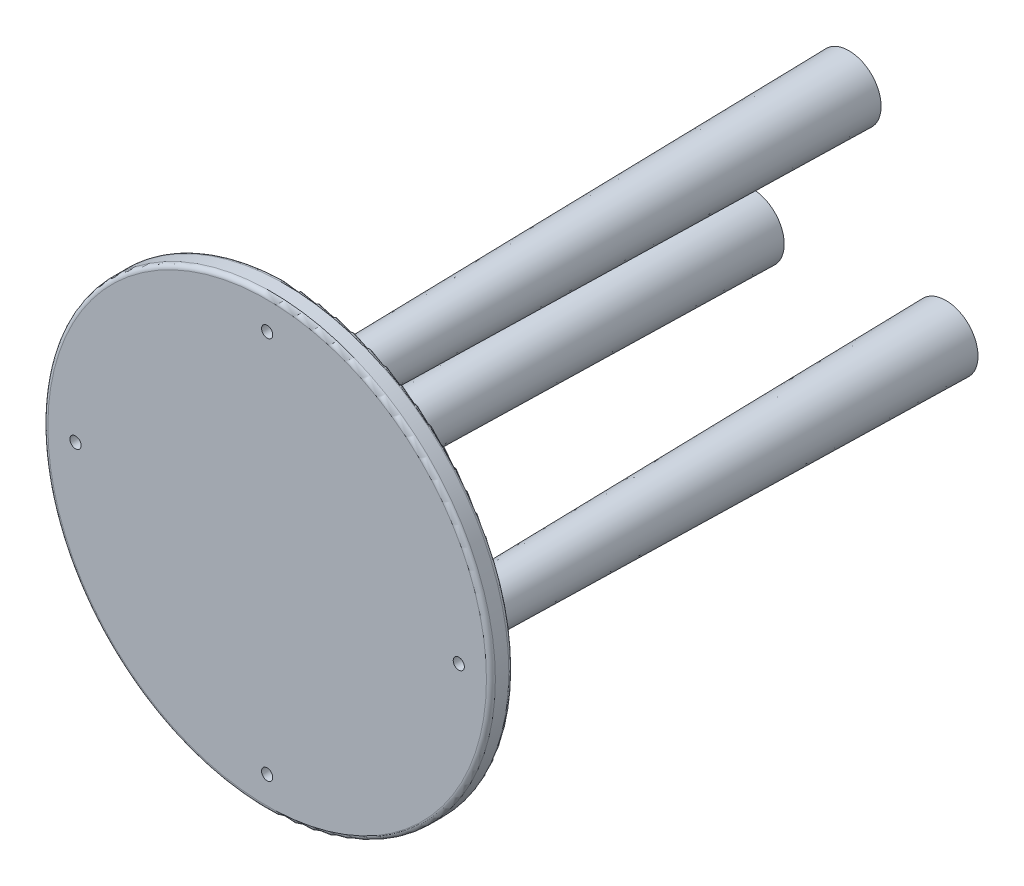
ISO-10303-21;
HEADER;
FILE_DESCRIPTION(('STEP AP214'),'2;1');
FILE_NAME('part.step','',(''),(''),'','','');
FILE_SCHEMA(('AUTOMOTIVE_DESIGN { 1 0 10303 214 1 1 1 1 }'));
ENDSEC;
DATA;
#1=APPLICATION_CONTEXT('core data for automotive mechanical design processes');
#2=APPLICATION_PROTOCOL_DEFINITION('international standard','automotive_design',2000,#1);
#3=PRODUCT_CONTEXT('',#1,'mechanical');
#4=PRODUCT('Part','Part','',(#3));
#5=PRODUCT_RELATED_PRODUCT_CATEGORY('part','',(#4));
#6=PRODUCT_DEFINITION_FORMATION('','',#4);
#7=PRODUCT_DEFINITION_CONTEXT('part definition',#1,'design');
#8=PRODUCT_DEFINITION('design','',#6,#7);
#9=PRODUCT_DEFINITION_SHAPE('','',#8);
#10=(LENGTH_UNIT() NAMED_UNIT(*) SI_UNIT(.MILLI.,.METRE.));
#11=(NAMED_UNIT(*) PLANE_ANGLE_UNIT() SI_UNIT($,.RADIAN.));
#12=(NAMED_UNIT(*) SI_UNIT($,.STERADIAN.) SOLID_ANGLE_UNIT());
#13=UNCERTAINTY_MEASURE_WITH_UNIT(LENGTH_MEASURE(1.E-05),#10,'distance_accuracy_value','');
#14=(GEOMETRIC_REPRESENTATION_CONTEXT(3) GLOBAL_UNCERTAINTY_ASSIGNED_CONTEXT((#13)) GLOBAL_UNIT_ASSIGNED_CONTEXT((#10,
#11,#12)) REPRESENTATION_CONTEXT('',''));
#15=CARTESIAN_POINT('',(0.,0.,0.));
#16=DIRECTION('',(0.,0.,1.));
#17=DIRECTION('',(1.,0.,0.));
#18=AXIS2_PLACEMENT_3D('',#15,#16,#17);
#19=CARTESIAN_POINT('',(0.,0.,10.));
#20=DIRECTION('',(0.,0.,-1.));
#21=DIRECTION('',(-1.,0.,0.));
#22=AXIS2_PLACEMENT_3D('',#19,#20,#21);
#23=CYLINDRICAL_SURFACE('',#22,100.);
#24=CARTESIAN_POINT('',(0.,0.,2.));
#25=DIRECTION('',(0.,0.,1.));
#26=DIRECTION('',(1.,0.,0.));
#27=AXIS2_PLACEMENT_3D('',#24,#25,#26);
#28=CIRCLE('',#27,100.);
#29=CARTESIAN_POINT('',(100.,0.,2.));
#30=VERTEX_POINT('',#29);
#31=EDGE_CURVE('E60',#30,#30,#28,.T.);
#32=ORIENTED_EDGE('',*,*,#31,.T.);
#33=EDGE_LOOP('',(#32));
#34=FACE_BOUND('',#33,.T.);
#35=CARTESIAN_POINT('',(0.,0.,8.));
#36=DIRECTION('',(0.,0.,1.));
#37=DIRECTION('',(1.,0.,0.));
#38=AXIS2_PLACEMENT_3D('',#35,#36,#37);
#39=CIRCLE('',#38,100.);
#40=CARTESIAN_POINT('',(100.,0.,8.));
#41=VERTEX_POINT('',#40);
#42=EDGE_CURVE('E63',#41,#41,#39,.F.);
#43=ORIENTED_EDGE('',*,*,#42,.T.);
#44=EDGE_LOOP('',(#43));
#45=FACE_BOUND('',#44,.T.);
#46=ADVANCED_FACE('F31',(#34,#45),#23,.T.);
#47=CARTESIAN_POINT('',(0.,0.,10.));
#48=DIRECTION('',(0.,0.,1.));
#49=DIRECTION('',(1.,0.,0.));
#50=AXIS2_PLACEMENT_3D('',#47,#48,#49);
#51=PLANE('',#50);
#52=CARTESIAN_POINT('',(-85.6457357193092,-0.0557357193094975,10.));
#53=DIRECTION('',(0.,0.,1.));
#54=DIRECTION('',(0.,1.,0.));
#55=AXIS2_PLACEMENT_3D('',#52,#53,#54);
#56=CIRCLE('',#55,2.5);
#57=CARTESIAN_POINT('',(-85.6457357193092,2.4442642806905,10.));
#58=VERTEX_POINT('',#57);
#59=EDGE_CURVE('E95',#58,#58,#56,.T.);
#60=ORIENTED_EDGE('',*,*,#59,.F.);
#61=EDGE_LOOP('',(#60));
#62=FACE_BOUND('',#61,.T.);
#63=CARTESIAN_POINT('',(0.,-85.7014714386184,10.));
#64=DIRECTION('',(0.,0.,1.));
#65=DIRECTION('',(-1.,0.,0.));
#66=AXIS2_PLACEMENT_3D('',#63,#64,#65);
#67=CIRCLE('',#66,2.5);
#68=CARTESIAN_POINT('',(-2.50000000000003,-85.7014714386184,10.));
#69=VERTEX_POINT('',#68);
#70=EDGE_CURVE('E88',#69,#69,#67,.T.);
#71=ORIENTED_EDGE('',*,*,#70,.F.);
#72=EDGE_LOOP('',(#71));
#73=FACE_BOUND('',#72,.T.);
#74=CARTESIAN_POINT('',(85.6457357193092,-0.0557357193083303,10.));
#75=DIRECTION('',(0.,0.,1.));
#76=DIRECTION('',(0.,-1.,0.));
#77=AXIS2_PLACEMENT_3D('',#74,#75,#76);
#78=CIRCLE('',#77,2.5);
#79=CARTESIAN_POINT('',(85.6457357193092,-2.55573571930833,10.));
#80=VERTEX_POINT('',#79);
#81=EDGE_CURVE('E89',#80,#80,#78,.T.);
#82=ORIENTED_EDGE('',*,*,#81,.F.);
#83=EDGE_LOOP('',(#82));
#84=FACE_BOUND('',#83,.T.);
#85=CARTESIAN_POINT('',(0.,85.59,10.));
#86=DIRECTION('',(0.,0.,1.));
#87=DIRECTION('',(1.,0.,0.));
#88=AXIS2_PLACEMENT_3D('',#85,#86,#87);
#89=CIRCLE('',#88,2.5);
#90=CARTESIAN_POINT('',(2.5,85.59,10.));
#91=VERTEX_POINT('',#90);
#92=EDGE_CURVE('E81',#91,#91,#89,.T.);
#93=ORIENTED_EDGE('',*,*,#92,.F.);
#94=EDGE_LOOP('',(#93));
#95=FACE_BOUND('',#94,.T.);
#96=CARTESIAN_POINT('',(0.,0.,10.));
#97=DIRECTION('',(0.,0.,1.));
#98=DIRECTION('',(1.,0.,0.));
#99=AXIS2_PLACEMENT_3D('',#96,#97,#98);
#100=CIRCLE('',#99,98.);
#101=CARTESIAN_POINT('',(98.,0.,10.));
#102=VERTEX_POINT('',#101);
#103=EDGE_CURVE('E66',#102,#102,#100,.T.);
#104=ORIENTED_EDGE('',*,*,#103,.T.);
#105=EDGE_LOOP('',(#104));
#106=FACE_BOUND('',#105,.T.);
#107=ADVANCED_FACE('F106',(#62,#73,#84,#95,#106),#51,.T.);
#108=CARTESIAN_POINT('',(0.,0.,0.));
#109=DIRECTION('',(0.,0.,1.));
#110=DIRECTION('',(1.,0.,0.));
#111=AXIS2_PLACEMENT_3D('',#108,#109,#110);
#112=PLANE('',#111);
#113=CARTESIAN_POINT('',(-85.6457357193092,-0.0557357193094975,0.));
#114=DIRECTION('',(0.,0.,1.));
#115=DIRECTION('',(1.,0.,0.));
#116=AXIS2_PLACEMENT_3D('',#113,#114,#115);
#117=CIRCLE('',#116,2.5);
#118=CARTESIAN_POINT('',(-83.1457357193092,-0.0557357193094975,0.));
#119=VERTEX_POINT('',#118);
#120=EDGE_CURVE('E84',#119,#119,#117,.F.);
#121=ORIENTED_EDGE('',*,*,#120,.F.);
#122=EDGE_LOOP('',(#121));
#123=FACE_BOUND('',#122,.T.);
#124=CARTESIAN_POINT('',(0.,-85.7014714386184,0.));
#125=DIRECTION('',(0.,0.,1.));
#126=DIRECTION('',(1.,0.,0.));
#127=AXIS2_PLACEMENT_3D('',#124,#125,#126);
#128=CIRCLE('',#127,2.5);
#129=CARTESIAN_POINT('',(2.49999999999997,-85.7014714386184,0.));
#130=VERTEX_POINT('',#129);
#131=EDGE_CURVE('E92',#130,#130,#128,.F.);
#132=ORIENTED_EDGE('',*,*,#131,.F.);
#133=EDGE_LOOP('',(#132));
#134=FACE_BOUND('',#133,.T.);
#135=CARTESIAN_POINT('',(85.6457357193092,-0.0557357193083303,0.));
#136=DIRECTION('',(0.,0.,1.));
#137=DIRECTION('',(1.,0.,0.));
#138=AXIS2_PLACEMENT_3D('',#135,#136,#137);
#139=CIRCLE('',#138,2.5);
#140=CARTESIAN_POINT('',(88.1457357193092,-0.0557357193083303,0.));
#141=VERTEX_POINT('',#140);
#142=EDGE_CURVE('E85',#141,#141,#139,.F.);
#143=ORIENTED_EDGE('',*,*,#142,.F.);
#144=EDGE_LOOP('',(#143));
#145=FACE_BOUND('',#144,.T.);
#146=CARTESIAN_POINT('',(2.14022504255095E-12,50.,0.));
#147=DIRECTION('',(0.,0.,1.));
#148=DIRECTION('',(1.,0.,0.));
#149=AXIS2_PLACEMENT_3D('',#146,#147,#148);
#150=CIRCLE('',#149,14.0704295718885);
#151=CARTESIAN_POINT('',(14.0704295718906,50.,0.));
#152=VERTEX_POINT('',#151);
#153=EDGE_CURVE('E46',#152,#152,#150,.T.);
#154=ORIENTED_EDGE('',*,*,#153,.T.);
#155=EDGE_LOOP('',(#154));
#156=FACE_BOUND('',#155,.T.);
#157=CARTESIAN_POINT('',(-43.3012701892218,-24.9999999999989,0.));
#158=DIRECTION('',(0.,0.,1.));
#159=DIRECTION('',(1.,0.,0.));
#160=AXIS2_PLACEMENT_3D('',#157,#158,#159);
#161=CIRCLE('',#160,14.0704295718885);
#162=CARTESIAN_POINT('',(-29.2308406173333,-24.9999999999989,0.));
#163=VERTEX_POINT('',#162);
#164=EDGE_CURVE('E51',#163,#163,#161,.T.);
#165=ORIENTED_EDGE('',*,*,#164,.T.);
#166=EDGE_LOOP('',(#165));
#167=FACE_BOUND('',#166,.T.);
#168=CARTESIAN_POINT('',(43.3012701892221,-25.0000000000011,0.));
#169=DIRECTION('',(0.,0.,1.));
#170=DIRECTION('',(1.,0.,0.));
#171=AXIS2_PLACEMENT_3D('',#168,#169,#170);
#172=CIRCLE('',#171,14.0704295718885);
#173=CARTESIAN_POINT('',(57.3716997611106,-25.0000000000011,0.));
#174=VERTEX_POINT('',#173);
#175=EDGE_CURVE('E54',#174,#174,#172,.T.);
#176=ORIENTED_EDGE('',*,*,#175,.T.);
#177=EDGE_LOOP('',(#176));
#178=FACE_BOUND('',#177,.T.);
#179=CARTESIAN_POINT('',(0.,85.59,0.));
#180=DIRECTION('',(0.,0.,1.));
#181=DIRECTION('',(1.,0.,0.));
#182=AXIS2_PLACEMENT_3D('',#179,#180,#181);
#183=CIRCLE('',#182,2.5);
#184=CARTESIAN_POINT('',(2.5,85.59,0.));
#185=VERTEX_POINT('',#184);
#186=EDGE_CURVE('E78',#185,#185,#183,.F.);
#187=ORIENTED_EDGE('',*,*,#186,.F.);
#188=EDGE_LOOP('',(#187));
#189=FACE_BOUND('',#188,.T.);
#190=CARTESIAN_POINT('',(0.,0.,0.));
#191=DIRECTION('',(0.,0.,1.));
#192=DIRECTION('',(1.,0.,0.));
#193=AXIS2_PLACEMENT_3D('',#190,#191,#192);
#194=CIRCLE('',#193,98.);
#195=CARTESIAN_POINT('',(98.,0.,0.));
#196=VERTEX_POINT('',#195);
#197=EDGE_CURVE('E57',#196,#196,#194,.F.);
#198=ORIENTED_EDGE('',*,*,#197,.T.);
#199=EDGE_LOOP('',(#198));
#200=FACE_BOUND('',#199,.T.);
#201=ADVANCED_FACE('F109',(#123,#134,#145,#156,#167,#178,#189,#200),#112,.F.);
#202=CARTESIAN_POINT('',(2.14022504255095E-12,50.,0.));
#203=DIRECTION('',(0.,0.,-1.));
#204=DIRECTION('',(1.,0.,0.));
#205=AXIS2_PLACEMENT_3D('',#202,#203,#204);
#206=CONICAL_SURFACE('',#205,10.,0.0174532925199433);
#207=CARTESIAN_POINT('',(2.14022504255095E-12,50.,-4.0698096257491));
#208=DIRECTION('',(0.,0.,1.));
#209=DIRECTION('',(1.,0.,0.));
#210=AXIS2_PLACEMENT_3D('',#207,#208,#209);
#211=CIRCLE('',#210,10.0710387912629);
#212=CARTESIAN_POINT('',(10.0710387912651,50.,-4.0698096257491));
#213=VERTEX_POINT('',#212);
#214=EDGE_CURVE('E42',#213,#213,#211,.F.);
#215=ORIENTED_EDGE('',*,*,#214,.T.);
#216=EDGE_LOOP('',(#215));
#217=FACE_BOUND('',#216,.T.);
#218=CARTESIAN_POINT('',(2.14022504255095E-12,50.,-250.));
#219=DIRECTION('',(0.,0.,1.));
#220=DIRECTION('',(1.,0.,0.));
#221=AXIS2_PLACEMENT_3D('',#218,#219,#220);
#222=CIRCLE('',#221,14.3637662320544);
#223=CARTESIAN_POINT('',(14.3637662320565,50.,-250.));
#224=VERTEX_POINT('',#223);
#225=EDGE_CURVE('E69',#224,#224,#222,.T.);
#226=ORIENTED_EDGE('',*,*,#225,.T.);
#227=EDGE_LOOP('',(#226));
#228=FACE_BOUND('',#227,.T.);
#229=ADVANCED_FACE('F144',(#217,#228),#206,.T.);
#230=CARTESIAN_POINT('',(2.14022504255095E-12,50.,-250.));
#231=DIRECTION('',(0.,0.,1.));
#232=DIRECTION('',(1.,0.,0.));
#233=AXIS2_PLACEMENT_3D('',#230,#231,#232);
#234=PLANE('',#233);
#235=ORIENTED_EDGE('',*,*,#225,.F.);
#236=EDGE_LOOP('',(#235));
#237=FACE_BOUND('',#236,.T.);
#238=ADVANCED_FACE('F149',(#237),#234,.F.);
#239=CARTESIAN_POINT('',(43.3012701892221,-25.0000000000011,0.));
#240=DIRECTION('',(0.,0.,-1.));
#241=DIRECTION('',(1.,0.,0.));
#242=AXIS2_PLACEMENT_3D('',#239,#240,#241);
#243=CONICAL_SURFACE('',#242,10.,0.0174532925199433);
#244=CARTESIAN_POINT('',(43.3012701892221,-25.0000000000011,-4.06980962574921));
#245=DIRECTION('',(0.,0.,1.));
#246=DIRECTION('',(1.,0.,0.));
#247=AXIS2_PLACEMENT_3D('',#244,#245,#246);
#248=CIRCLE('',#247,10.0710387912629);
#249=CARTESIAN_POINT('',(53.372308980485,-25.0000000000011,-4.06980962574921));
#250=VERTEX_POINT('',#249);
#251=EDGE_CURVE('E10',#250,#250,#248,.F.);
#252=ORIENTED_EDGE('',*,*,#251,.T.);
#253=EDGE_LOOP('',(#252));
#254=FACE_BOUND('',#253,.T.);
#255=CARTESIAN_POINT('',(43.3012701892221,-25.0000000000011,-250.));
#256=DIRECTION('',(0.,0.,1.));
#257=DIRECTION('',(1.,0.,0.));
#258=AXIS2_PLACEMENT_3D('',#255,#256,#257);
#259=CIRCLE('',#258,14.3637662320544);
#260=CARTESIAN_POINT('',(57.6650364212765,-25.0000000000011,-250.));
#261=VERTEX_POINT('',#260);
#262=EDGE_CURVE('E72',#261,#261,#259,.T.);
#263=ORIENTED_EDGE('',*,*,#262,.T.);
#264=EDGE_LOOP('',(#263));
#265=FACE_BOUND('',#264,.T.);
#266=ADVANCED_FACE('F153',(#254,#265),#243,.T.);
#267=CARTESIAN_POINT('',(43.3012701892221,-25.0000000000011,-250.));
#268=DIRECTION('',(0.,0.,1.));
#269=DIRECTION('',(1.,0.,0.));
#270=AXIS2_PLACEMENT_3D('',#267,#268,#269);
#271=PLANE('',#270);
#272=ORIENTED_EDGE('',*,*,#262,.F.);
#273=EDGE_LOOP('',(#272));
#274=FACE_BOUND('',#273,.T.);
#275=ADVANCED_FACE('F157',(#274),#271,.F.);
#276=CARTESIAN_POINT('',(-43.3012701892218,-24.9999999999989,0.));
#277=DIRECTION('',(0.,0.,-1.));
#278=DIRECTION('',(1.,0.,0.));
#279=AXIS2_PLACEMENT_3D('',#276,#277,#278);
#280=CONICAL_SURFACE('',#279,10.,0.0174532925199433);
#281=CARTESIAN_POINT('',(-43.3012701892218,-24.9999999999989,-4.06980962574921));
#282=DIRECTION('',(0.,0.,1.));
#283=DIRECTION('',(1.,0.,0.));
#284=AXIS2_PLACEMENT_3D('',#281,#282,#283);
#285=CIRCLE('',#284,10.0710387912629);
#286=CARTESIAN_POINT('',(-33.2302313979588,-24.9999999999989,-4.06980962574921));
#287=VERTEX_POINT('',#286);
#288=EDGE_CURVE('E38',#287,#287,#285,.F.);
#289=ORIENTED_EDGE('',*,*,#288,.T.);
#290=EDGE_LOOP('',(#289));
#291=FACE_BOUND('',#290,.T.);
#292=CARTESIAN_POINT('',(-43.3012701892218,-24.9999999999989,-250.));
#293=DIRECTION('',(0.,0.,1.));
#294=DIRECTION('',(1.,0.,0.));
#295=AXIS2_PLACEMENT_3D('',#292,#293,#294);
#296=CIRCLE('',#295,14.3637662320544);
#297=CARTESIAN_POINT('',(-28.9375039571674,-24.9999999999989,-250.));
#298=VERTEX_POINT('',#297);
#299=EDGE_CURVE('E75',#298,#298,#296,.T.);
#300=ORIENTED_EDGE('',*,*,#299,.T.);
#301=EDGE_LOOP('',(#300));
#302=FACE_BOUND('',#301,.T.);
#303=ADVANCED_FACE('F132',(#291,#302),#280,.T.);
#304=CARTESIAN_POINT('',(-43.3012701892218,-24.9999999999989,-250.));
#305=DIRECTION('',(0.,0.,1.));
#306=DIRECTION('',(1.,0.,0.));
#307=AXIS2_PLACEMENT_3D('',#304,#305,#306);
#308=PLANE('',#307);
#309=ORIENTED_EDGE('',*,*,#299,.F.);
#310=EDGE_LOOP('',(#309));
#311=FACE_BOUND('',#310,.T.);
#312=ADVANCED_FACE('F122',(#311),#308,.F.);
#313=CARTESIAN_POINT('',(0.,0.,8.));
#314=DIRECTION('',(0.,0.,1.));
#315=DIRECTION('',(1.,0.,0.));
#316=AXIS2_PLACEMENT_3D('',#313,#314,#315);
#317=TOROIDAL_SURFACE('',#316,98.,2.);
#318=ORIENTED_EDGE('',*,*,#42,.F.);
#319=EDGE_LOOP('',(#318));
#320=FACE_BOUND('',#319,.T.);
#321=ORIENTED_EDGE('',*,*,#103,.F.);
#322=EDGE_LOOP('',(#321));
#323=FACE_BOUND('',#322,.T.);
#324=ADVANCED_FACE('F119',(#320,#323),#317,.T.);
#325=CARTESIAN_POINT('',(0.,0.,2.));
#326=DIRECTION('',(0.,0.,1.));
#327=DIRECTION('',(1.,0.,0.));
#328=AXIS2_PLACEMENT_3D('',#325,#326,#327);
#329=TOROIDAL_SURFACE('',#328,98.,2.);
#330=ORIENTED_EDGE('',*,*,#197,.F.);
#331=EDGE_LOOP('',(#330));
#332=FACE_BOUND('',#331,.T.);
#333=ORIENTED_EDGE('',*,*,#31,.F.);
#334=EDGE_LOOP('',(#333));
#335=FACE_BOUND('',#334,.T.);
#336=ADVANCED_FACE('F121',(#332,#335),#329,.T.);
#337=CARTESIAN_POINT('',(0.,85.59,-250.001));
#338=DIRECTION('',(0.,0.,1.));
#339=DIRECTION('',(1.,0.,0.));
#340=AXIS2_PLACEMENT_3D('',#337,#338,#339);
#341=CYLINDRICAL_SURFACE('',#340,2.5);
#342=ORIENTED_EDGE('',*,*,#92,.T.);
#343=EDGE_LOOP('',(#342));
#344=FACE_BOUND('',#343,.T.);
#345=ORIENTED_EDGE('',*,*,#186,.T.);
#346=EDGE_LOOP('',(#345));
#347=FACE_BOUND('',#346,.T.);
#348=ADVANCED_FACE('F129',(#344,#347),#341,.F.);
#349=CARTESIAN_POINT('',(2.14022504255095E-12,50.,-4.));
#350=DIRECTION('',(0.,0.,1.));
#351=DIRECTION('',(1.,0.,0.));
#352=AXIS2_PLACEMENT_3D('',#349,#350,#351);
#353=TOROIDAL_SURFACE('',#352,14.0704295718885,4.);
#354=ORIENTED_EDGE('',*,*,#214,.F.);
#355=EDGE_LOOP('',(#354));
#356=FACE_BOUND('',#355,.T.);
#357=ORIENTED_EDGE('',*,*,#153,.F.);
#358=EDGE_LOOP('',(#357));
#359=FACE_BOUND('',#358,.T.);
#360=ADVANCED_FACE('F165',(#356,#359),#353,.F.);
#361=CARTESIAN_POINT('',(-43.3012701892218,-24.9999999999989,-4.));
#362=DIRECTION('',(0.,0.,1.));
#363=DIRECTION('',(1.,0.,0.));
#364=AXIS2_PLACEMENT_3D('',#361,#362,#363);
#365=TOROIDAL_SURFACE('',#364,14.0704295718885,4.);
#366=ORIENTED_EDGE('',*,*,#288,.F.);
#367=EDGE_LOOP('',(#366));
#368=FACE_BOUND('',#367,.T.);
#369=ORIENTED_EDGE('',*,*,#164,.F.);
#370=EDGE_LOOP('',(#369));
#371=FACE_BOUND('',#370,.T.);
#372=ADVANCED_FACE('F193',(#368,#371),#365,.F.);
#373=CARTESIAN_POINT('',(43.3012701892221,-25.0000000000011,-4.));
#374=DIRECTION('',(0.,0.,1.));
#375=DIRECTION('',(1.,0.,0.));
#376=AXIS2_PLACEMENT_3D('',#373,#374,#375);
#377=TOROIDAL_SURFACE('',#376,14.0704295718885,4.);
#378=ORIENTED_EDGE('',*,*,#251,.F.);
#379=EDGE_LOOP('',(#378));
#380=FACE_BOUND('',#379,.T.);
#381=ORIENTED_EDGE('',*,*,#175,.F.);
#382=EDGE_LOOP('',(#381));
#383=FACE_BOUND('',#382,.T.);
#384=ADVANCED_FACE('F33',(#380,#383),#377,.F.);
#385=CARTESIAN_POINT('',(85.6457357193092,-0.0557357193083303,-250.001));
#386=DIRECTION('',(0.,0.,1.));
#387=DIRECTION('',(1.,0.,0.));
#388=AXIS2_PLACEMENT_3D('',#385,#386,#387);
#389=CYLINDRICAL_SURFACE('',#388,2.5);
#390=ORIENTED_EDGE('',*,*,#81,.T.);
#391=EDGE_LOOP('',(#390));
#392=FACE_BOUND('',#391,.T.);
#393=ORIENTED_EDGE('',*,*,#142,.T.);
#394=EDGE_LOOP('',(#393));
#395=FACE_BOUND('',#394,.T.);
#396=ADVANCED_FACE('F167',(#392,#395),#389,.F.);
#397=CARTESIAN_POINT('',(0.,-85.7014714386184,-250.001));
#398=DIRECTION('',(0.,0.,1.));
#399=DIRECTION('',(1.,0.,0.));
#400=AXIS2_PLACEMENT_3D('',#397,#398,#399);
#401=CYLINDRICAL_SURFACE('',#400,2.5);
#402=ORIENTED_EDGE('',*,*,#70,.T.);
#403=EDGE_LOOP('',(#402));
#404=FACE_BOUND('',#403,.T.);
#405=ORIENTED_EDGE('',*,*,#131,.T.);
#406=EDGE_LOOP('',(#405));
#407=FACE_BOUND('',#406,.T.);
#408=ADVANCED_FACE('F170',(#404,#407),#401,.F.);
#409=CARTESIAN_POINT('',(-85.6457357193092,-0.0557357193094975,-250.001));
#410=DIRECTION('',(0.,0.,1.));
#411=DIRECTION('',(1.,0.,0.));
#412=AXIS2_PLACEMENT_3D('',#409,#410,#411);
#413=CYLINDRICAL_SURFACE('',#412,2.5);
#414=ORIENTED_EDGE('',*,*,#59,.T.);
#415=EDGE_LOOP('',(#414));
#416=FACE_BOUND('',#415,.T.);
#417=ORIENTED_EDGE('',*,*,#120,.T.);
#418=EDGE_LOOP('',(#417));
#419=FACE_BOUND('',#418,.T.);
#420=ADVANCED_FACE('F103',(#416,#419),#413,.F.);
#421=CLOSED_SHELL('',(#46,#107,#201,#229,#238,#266,#275,#303,#312,#324,#336,#348,#360,#372,#384,
#396,#408,#420));
#422=MANIFOLD_SOLID_BREP('B2',#421);
#423=ADVANCED_BREP_SHAPE_REPRESENTATION('',(#18,#422),#14);
#424=SHAPE_DEFINITION_REPRESENTATION(#9,#423);
ENDSEC;
END-ISO-10303-21;
